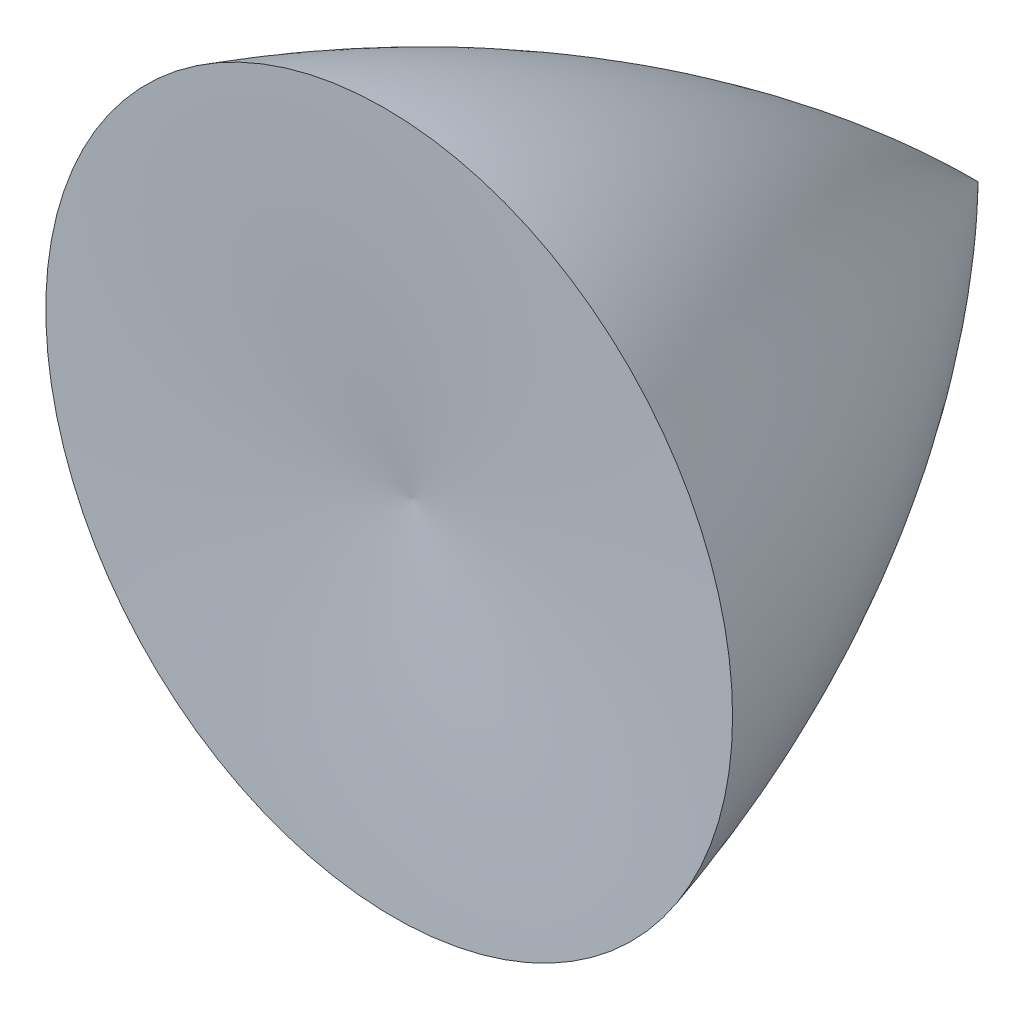
ISO-10303-21;
HEADER;
FILE_DESCRIPTION(('STEP AP214'),'2;1');
FILE_NAME('part.step','',(''),(''),'','','');
FILE_SCHEMA(('AUTOMOTIVE_DESIGN { 1 0 10303 214 1 1 1 1 }'));
ENDSEC;
DATA;
#1=APPLICATION_CONTEXT('core data for automotive mechanical design processes');
#2=APPLICATION_PROTOCOL_DEFINITION('international standard','automotive_design',2000,#1);
#3=PRODUCT_CONTEXT('',#1,'mechanical');
#4=PRODUCT('Part','Part','',(#3));
#5=PRODUCT_RELATED_PRODUCT_CATEGORY('part','',(#4));
#6=PRODUCT_DEFINITION_FORMATION('','',#4);
#7=PRODUCT_DEFINITION_CONTEXT('part definition',#1,'design');
#8=PRODUCT_DEFINITION('design','',#6,#7);
#9=PRODUCT_DEFINITION_SHAPE('','',#8);
#10=(LENGTH_UNIT() NAMED_UNIT(*) SI_UNIT(.MILLI.,.METRE.));
#11=(NAMED_UNIT(*) PLANE_ANGLE_UNIT() SI_UNIT($,.RADIAN.));
#12=(NAMED_UNIT(*) SI_UNIT($,.STERADIAN.) SOLID_ANGLE_UNIT());
#13=UNCERTAINTY_MEASURE_WITH_UNIT(LENGTH_MEASURE(1.E-05),#10,'distance_accuracy_value','');
#14=(GEOMETRIC_REPRESENTATION_CONTEXT(3) GLOBAL_UNCERTAINTY_ASSIGNED_CONTEXT((#13)) GLOBAL_UNIT_ASSIGNED_CONTEXT((#10,
#11,#12)) REPRESENTATION_CONTEXT('',''));
#15=CARTESIAN_POINT('',(0.,0.,0.));
#16=DIRECTION('',(0.,0.,1.));
#17=DIRECTION('',(1.,0.,0.));
#18=AXIS2_PLACEMENT_3D('',#15,#16,#17);
#19=CARTESIAN_POINT('',(98.9238317985668,0.,-846.013219944138));
#20=DIRECTION('',(0.,-1.,0.));
#21=DIRECTION('',(0.999909602819115,0.,0.0134456755174408));
#22=AXIS2_PLACEMENT_3D('',#19,#20,#21);
#23=CIRCLE('',#22,851.777137999113);
#24=TRIMMED_CURVE('',#23,(PARAMETER_VALUE(-1.67375108626677)),
(PARAMETER_VALUE(1.67375108626677)),.T.,.PARAMETER.);
#25=CARTESIAN_POINT('',(11.392075013746,0.,-847.190249943532));
#26=DIRECTION('',(-0.0134456755174408,0.,0.999909602819115));
#27=AXIS1_PLACEMENT('',#25,#26);
#28=SURFACE_OF_REVOLUTION('',#24,#27);
#29=CARTESIAN_POINT('',(0.,0.,0.));
#30=VERTEX_POINT('',#29);
#31=VERTEX_LOOP('',#30);
#32=FACE_BOUND('',#31,.T.);
#33=CARTESIAN_POINT('',(-0.0557703033073735,0.,4.14744962102073));
#34=DIRECTION('',(-0.0134456755174408,0.,0.999909602819115));
#35=DIRECTION('',(0.999909602819115,0.,0.0134456755174408));
#36=AXIS2_PLACEMENT_3D('',#33,#34,#35);
#37=CIRCLE('',#36,62.6929207253189);
#38=CARTESIAN_POINT('',(62.6314831587165,0.,4.990398290334));
#39=VERTEX_POINT('',#38);
#40=EDGE_CURVE('E11',#39,#39,#37,.T.);
#41=ORIENTED_EDGE('',*,*,#40,.T.);
#42=EDGE_LOOP('',(#41));
#43=FACE_BOUND('',#42,.T.);
#44=ADVANCED_FACE('F33',(#32,#43),#28,.T.);
#45=CARTESIAN_POINT('',(-173.498328916567,0.,71.6342010620214));
#46=DIRECTION('',(0.,-1.,0.));
#47=DIRECTION('',(0.999909602819115,0.,0.0134456755174408));
#48=AXIS2_PLACEMENT_3D('',#45,#46,#47);
#49=CIRCLE('',#48,245.354202325088);
#50=TRIMMED_CURVE('',#49,(PARAMETER_VALUE(-0.790985994299038)),
(PARAMETER_VALUE(0.790985994299038)),.T.,.PARAMETER.);
#51=CARTESIAN_POINT('',(-0.99444925743522,0.,73.953841942414));
#52=DIRECTION('',(-0.0134456755174408,0.,0.999909602819115));
#53=AXIS1_PLACEMENT('',#51,#52);
#54=SURFACE_OF_REVOLUTION('',#50,#53);
#55=ORIENTED_EDGE('',*,*,#40,.F.);
#56=EDGE_LOOP('',(#55));
#57=FACE_BOUND('',#56,.T.);
#58=CARTESIAN_POINT('',(1.35126108803432,0.,-100.488736031799));
#59=VERTEX_POINT('',#58);
#60=VERTEX_LOOP('',#59);
#61=FACE_BOUND('',#60,.T.);
#62=ADVANCED_FACE('F46',(#57,#61),#54,.T.);
#63=CLOSED_SHELL('',(#44,#62));
#64=MANIFOLD_SOLID_BREP('B2',#63);
#65=ADVANCED_BREP_SHAPE_REPRESENTATION('',(#18,#64),#14);
#66=SHAPE_DEFINITION_REPRESENTATION(#9,#65);
ENDSEC;
END-ISO-10303-21;
